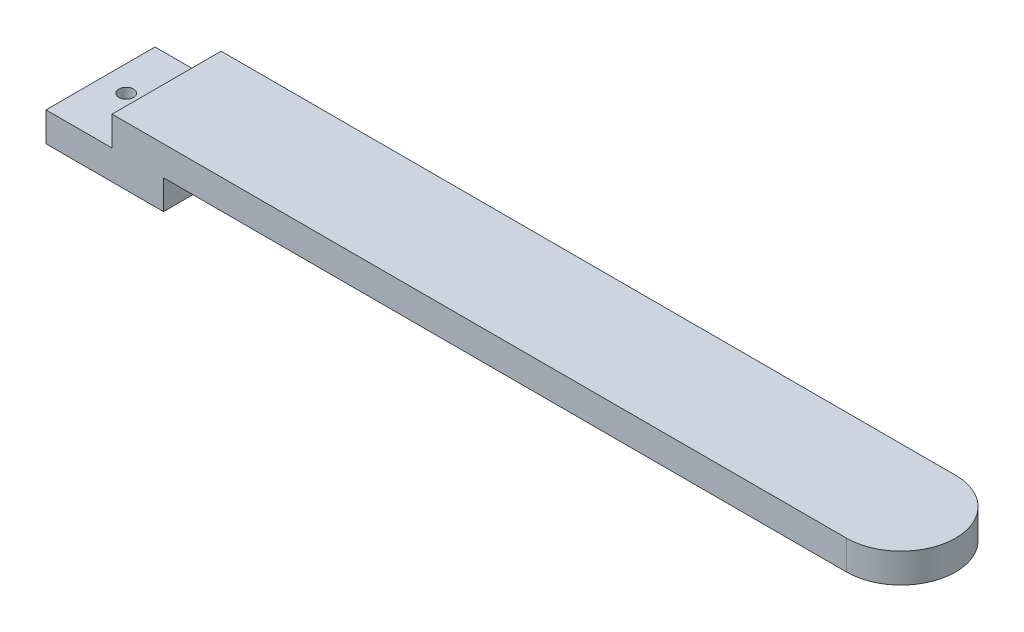
ISO-10303-21;
HEADER;
FILE_DESCRIPTION(('STEP AP214'),'2;1');
FILE_NAME('part.step','',(''),(''),'','','');
FILE_SCHEMA(('AUTOMOTIVE_DESIGN { 1 0 10303 214 1 1 1 1 }'));
ENDSEC;
DATA;
#1=APPLICATION_CONTEXT('core data for automotive mechanical design processes');
#2=APPLICATION_PROTOCOL_DEFINITION('international standard','automotive_design',2000,#1);
#3=PRODUCT_CONTEXT('',#1,'mechanical');
#4=PRODUCT('Part','Part','',(#3));
#5=PRODUCT_RELATED_PRODUCT_CATEGORY('part','',(#4));
#6=PRODUCT_DEFINITION_FORMATION('','',#4);
#7=PRODUCT_DEFINITION_CONTEXT('part definition',#1,'design');
#8=PRODUCT_DEFINITION('design','',#6,#7);
#9=PRODUCT_DEFINITION_SHAPE('','',#8);
#10=(LENGTH_UNIT() NAMED_UNIT(*) SI_UNIT(.MILLI.,.METRE.));
#11=(NAMED_UNIT(*) PLANE_ANGLE_UNIT() SI_UNIT($,.RADIAN.));
#12=(NAMED_UNIT(*) SI_UNIT($,.STERADIAN.) SOLID_ANGLE_UNIT());
#13=UNCERTAINTY_MEASURE_WITH_UNIT(LENGTH_MEASURE(1.E-05),#10,'distance_accuracy_value','');
#14=(GEOMETRIC_REPRESENTATION_CONTEXT(3) GLOBAL_UNCERTAINTY_ASSIGNED_CONTEXT((#13)) GLOBAL_UNIT_ASSIGNED_CONTEXT((#10,
#11,#12)) REPRESENTATION_CONTEXT('',''));
#15=CARTESIAN_POINT('',(0.,0.,0.));
#16=DIRECTION('',(0.,0.,1.));
#17=DIRECTION('',(1.,0.,0.));
#18=AXIS2_PLACEMENT_3D('',#15,#16,#17);
#19=CARTESIAN_POINT('',(200.,0.,0.));
#20=DIRECTION('',(0.,-1.,0.));
#21=DIRECTION('',(0.,0.,-1.));
#22=AXIS2_PLACEMENT_3D('',#19,#20,#21);
#23=PLANE('',#22);
#24=DIRECTION('',(1.,0.,0.));
#25=VECTOR('',#24,1.);
#26=CARTESIAN_POINT('',(0.,0.,14.84));
#27=LINE('',#26,#25);
#28=CARTESIAN_POINT('',(14.,0.,14.84));
#29=VERTEX_POINT('',#28);
#30=CARTESIAN_POINT('',(200.,0.,14.84));
#31=VERTEX_POINT('',#30);
#32=EDGE_CURVE('E165',#29,#31,#27,.T.);
#33=ORIENTED_EDGE('',*,*,#32,.F.);
#34=DIRECTION('',(0.,0.,-1.));
#35=VECTOR('',#34,1.);
#36=CARTESIAN_POINT('',(14.,0.,-14.84));
#37=LINE('',#36,#35);
#38=CARTESIAN_POINT('',(14.,0.,-14.84));
#39=VERTEX_POINT('',#38);
#40=EDGE_CURVE('E144',#29,#39,#37,.T.);
#41=ORIENTED_EDGE('',*,*,#40,.T.);
#42=DIRECTION('',(-1.,0.,0.));
#43=VECTOR('',#42,1.);
#44=CARTESIAN_POINT('',(0.,0.,-14.84));
#45=LINE('',#44,#43);
#46=CARTESIAN_POINT('',(200.,0.,-14.84));
#47=VERTEX_POINT('',#46);
#48=EDGE_CURVE('E118',#47,#39,#45,.T.);
#49=ORIENTED_EDGE('',*,*,#48,.F.);
#50=CARTESIAN_POINT('',(200.,0.,0.));
#51=DIRECTION('',(0.,1.,0.));
#52=DIRECTION('',(0.,0.,-1.));
#53=AXIS2_PLACEMENT_3D('',#50,#51,#52);
#54=CIRCLE('',#53,14.84);
#55=EDGE_CURVE('E77',#31,#47,#54,.T.);
#56=ORIENTED_EDGE('',*,*,#55,.F.);
#57=EDGE_LOOP('',(#33,#41,#49,#56));
#58=FACE_BOUND('',#57,.T.);
#59=ADVANCED_FACE('F37',(#58),#23,.T.);
#60=CARTESIAN_POINT('',(0.,8.,-14.84));
#61=DIRECTION('',(1.,0.,0.));
#62=DIRECTION('',(0.,0.,-1.));
#63=AXIS2_PLACEMENT_3D('',#60,#61,#62);
#64=PLANE('',#63);
#65=DIRECTION('',(0.,0.,1.));
#66=VECTOR('',#65,1.);
#67=CARTESIAN_POINT('',(0.,0.,-14.84));
#68=LINE('',#67,#66);
#69=CARTESIAN_POINT('',(0.,0.,-14.84));
#70=VERTEX_POINT('',#69);
#71=CARTESIAN_POINT('',(0.,0.,14.84));
#72=VERTEX_POINT('',#71);
#73=EDGE_CURVE('E152',#70,#72,#68,.T.);
#74=ORIENTED_EDGE('',*,*,#73,.T.);
#75=DIRECTION('',(0.,-1.,0.));
#76=VECTOR('',#75,1.);
#77=CARTESIAN_POINT('',(0.,8.,14.84));
#78=LINE('',#77,#76);
#79=CARTESIAN_POINT('',(0.,8.,14.84));
#80=VERTEX_POINT('',#79);
#81=EDGE_CURVE('E11',#80,#72,#78,.T.);
#82=ORIENTED_EDGE('',*,*,#81,.F.);
#83=DIRECTION('',(0.,0.,1.));
#84=VECTOR('',#83,1.);
#85=CARTESIAN_POINT('',(0.,8.,-14.84));
#86=LINE('',#85,#84);
#87=CARTESIAN_POINT('',(0.,8.,-14.84));
#88=VERTEX_POINT('',#87);
#89=EDGE_CURVE('E156',#88,#80,#86,.T.);
#90=ORIENTED_EDGE('',*,*,#89,.F.);
#91=DIRECTION('',(0.,-1.,0.));
#92=VECTOR('',#91,1.);
#93=CARTESIAN_POINT('',(0.,8.,-14.84));
#94=LINE('',#93,#92);
#95=EDGE_CURVE('E162',#88,#70,#94,.T.);
#96=ORIENTED_EDGE('',*,*,#95,.T.);
#97=EDGE_LOOP('',(#74,#82,#90,#96));
#98=FACE_BOUND('',#97,.T.);
#99=ADVANCED_FACE('F39',(#98),#64,.F.);
#100=CARTESIAN_POINT('',(0.,8.,14.84));
#101=DIRECTION('',(0.,0.,-1.));
#102=DIRECTION('',(-1.,0.,0.));
#103=AXIS2_PLACEMENT_3D('',#100,#101,#102);
#104=PLANE('',#103);
#105=ORIENTED_EDGE('',*,*,#81,.T.);
#106=DIRECTION('',(1.,0.,0.));
#107=VECTOR('',#106,1.);
#108=CARTESIAN_POINT('',(14.,0.,14.84));
#109=LINE('',#108,#107);
#110=CARTESIAN_POINT('',(-18.,0.,14.84));
#111=VERTEX_POINT('',#110);
#112=EDGE_CURVE('E134',#111,#72,#109,.T.);
#113=ORIENTED_EDGE('',*,*,#112,.F.);
#114=DIRECTION('',(0.,1.,0.));
#115=VECTOR('',#114,1.);
#116=CARTESIAN_POINT('',(-18.,-8.,14.84));
#117=LINE('',#116,#115);
#118=CARTESIAN_POINT('',(-18.,-8.,14.84));
#119=VERTEX_POINT('',#118);
#120=EDGE_CURVE('E153',#119,#111,#117,.T.);
#121=ORIENTED_EDGE('',*,*,#120,.F.);
#122=DIRECTION('',(1.,0.,0.));
#123=VECTOR('',#122,1.);
#124=CARTESIAN_POINT('',(14.,-8.,14.84));
#125=LINE('',#124,#123);
#126=CARTESIAN_POINT('',(14.,-8.,14.84));
#127=VERTEX_POINT('',#126);
#128=EDGE_CURVE('E120',#119,#127,#125,.T.);
#129=ORIENTED_EDGE('',*,*,#128,.T.);
#130=DIRECTION('',(0.,1.,0.));
#131=VECTOR('',#130,1.);
#132=CARTESIAN_POINT('',(14.,-8.,14.84));
#133=LINE('',#132,#131);
#134=EDGE_CURVE('E133',#127,#29,#133,.T.);
#135=ORIENTED_EDGE('',*,*,#134,.T.);
#136=ORIENTED_EDGE('',*,*,#32,.T.);
#137=DIRECTION('',(0.,-1.,0.));
#138=VECTOR('',#137,1.);
#139=CARTESIAN_POINT('',(200.,8.,14.84));
#140=LINE('',#139,#138);
#141=CARTESIAN_POINT('',(200.,8.,14.84));
#142=VERTEX_POINT('',#141);
#143=EDGE_CURVE('E45',#142,#31,#140,.T.);
#144=ORIENTED_EDGE('',*,*,#143,.F.);
#145=DIRECTION('',(1.,0.,0.));
#146=VECTOR('',#145,1.);
#147=CARTESIAN_POINT('',(0.,8.,14.84));
#148=LINE('',#147,#146);
#149=EDGE_CURVE('E84',#80,#142,#148,.T.);
#150=ORIENTED_EDGE('',*,*,#149,.F.);
#151=EDGE_LOOP('',(#105,#113,#121,#129,#135,#136,#144,#150));
#152=FACE_BOUND('',#151,.T.);
#153=ADVANCED_FACE('F176',(#152),#104,.F.);
#154=CARTESIAN_POINT('',(200.,8.,0.));
#155=DIRECTION('',(0.,-1.,0.));
#156=DIRECTION('',(0.,0.,-1.));
#157=AXIS2_PLACEMENT_3D('',#154,#155,#156);
#158=CYLINDRICAL_SURFACE('',#157,14.84);
#159=ORIENTED_EDGE('',*,*,#55,.T.);
#160=DIRECTION('',(0.,-1.,0.));
#161=VECTOR('',#160,1.);
#162=CARTESIAN_POINT('',(200.,8.,-14.84));
#163=LINE('',#162,#161);
#164=CARTESIAN_POINT('',(200.,8.,-14.84));
#165=VERTEX_POINT('',#164);
#166=EDGE_CURVE('E171',#165,#47,#163,.T.);
#167=ORIENTED_EDGE('',*,*,#166,.F.);
#168=CARTESIAN_POINT('',(200.,8.,0.));
#169=DIRECTION('',(0.,1.,0.));
#170=DIRECTION('',(0.,0.,-1.));
#171=AXIS2_PLACEMENT_3D('',#168,#169,#170);
#172=CIRCLE('',#171,14.84);
#173=EDGE_CURVE('E159',#142,#165,#172,.T.);
#174=ORIENTED_EDGE('',*,*,#173,.F.);
#175=ORIENTED_EDGE('',*,*,#143,.T.);
#176=EDGE_LOOP('',(#159,#167,#174,#175));
#177=FACE_BOUND('',#176,.T.);
#178=ADVANCED_FACE('F173',(#177),#158,.T.);
#179=CARTESIAN_POINT('',(0.,8.,-14.84));
#180=DIRECTION('',(0.,0.,1.));
#181=DIRECTION('',(1.,0.,0.));
#182=AXIS2_PLACEMENT_3D('',#179,#180,#181);
#183=PLANE('',#182);
#184=ORIENTED_EDGE('',*,*,#48,.T.);
#185=DIRECTION('',(0.,1.,0.));
#186=VECTOR('',#185,1.);
#187=CARTESIAN_POINT('',(14.,-8.,-14.84));
#188=LINE('',#187,#186);
#189=CARTESIAN_POINT('',(14.,-8.,-14.84));
#190=VERTEX_POINT('',#189);
#191=EDGE_CURVE('E52',#190,#39,#188,.T.);
#192=ORIENTED_EDGE('',*,*,#191,.F.);
#193=DIRECTION('',(-1.,0.,0.));
#194=VECTOR('',#193,1.);
#195=CARTESIAN_POINT('',(14.,-8.,-14.84));
#196=LINE('',#195,#194);
#197=CARTESIAN_POINT('',(-18.,-8.,-14.84));
#198=VERTEX_POINT('',#197);
#199=EDGE_CURVE('E116',#190,#198,#196,.T.);
#200=ORIENTED_EDGE('',*,*,#199,.T.);
#201=DIRECTION('',(0.,1.,0.));
#202=VECTOR('',#201,1.);
#203=CARTESIAN_POINT('',(-18.,-8.,-14.84));
#204=LINE('',#203,#202);
#205=CARTESIAN_POINT('',(-18.,0.,-14.84));
#206=VERTEX_POINT('',#205);
#207=EDGE_CURVE('E119',#198,#206,#204,.T.);
#208=ORIENTED_EDGE('',*,*,#207,.T.);
#209=DIRECTION('',(-1.,0.,0.));
#210=VECTOR('',#209,1.);
#211=CARTESIAN_POINT('',(14.,0.,-14.84));
#212=LINE('',#211,#210);
#213=EDGE_CURVE('E146',#70,#206,#212,.T.);
#214=ORIENTED_EDGE('',*,*,#213,.F.);
#215=ORIENTED_EDGE('',*,*,#95,.F.);
#216=DIRECTION('',(-1.,0.,0.));
#217=VECTOR('',#216,1.);
#218=CARTESIAN_POINT('',(0.,8.,-14.84));
#219=LINE('',#218,#217);
#220=EDGE_CURVE('E61',#165,#88,#219,.T.);
#221=ORIENTED_EDGE('',*,*,#220,.F.);
#222=ORIENTED_EDGE('',*,*,#166,.T.);
#223=EDGE_LOOP('',(#184,#192,#200,#208,#214,#215,#221,#222));
#224=FACE_BOUND('',#223,.T.);
#225=ADVANCED_FACE('F114',(#224),#183,.F.);
#226=CARTESIAN_POINT('',(200.,8.,0.));
#227=DIRECTION('',(0.,-1.,0.));
#228=DIRECTION('',(0.,0.,-1.));
#229=AXIS2_PLACEMENT_3D('',#226,#227,#228);
#230=PLANE('',#229);
#231=ORIENTED_EDGE('',*,*,#89,.T.);
#232=ORIENTED_EDGE('',*,*,#149,.T.);
#233=ORIENTED_EDGE('',*,*,#173,.T.);
#234=ORIENTED_EDGE('',*,*,#220,.T.);
#235=EDGE_LOOP('',(#231,#232,#233,#234));
#236=FACE_BOUND('',#235,.T.);
#237=ADVANCED_FACE('F186',(#236),#230,.F.);
#238=CARTESIAN_POINT('',(14.,-8.,-14.84));
#239=DIRECTION('',(1.,0.,0.));
#240=DIRECTION('',(0.,0.,-1.));
#241=AXIS2_PLACEMENT_3D('',#238,#239,#240);
#242=PLANE('',#241);
#243=ORIENTED_EDGE('',*,*,#40,.F.);
#244=ORIENTED_EDGE('',*,*,#134,.F.);
#245=DIRECTION('',(0.,0.,-1.));
#246=VECTOR('',#245,1.);
#247=CARTESIAN_POINT('',(14.,-8.,-14.84));
#248=LINE('',#247,#246);
#249=EDGE_CURVE('E127',#127,#190,#248,.T.);
#250=ORIENTED_EDGE('',*,*,#249,.T.);
#251=ORIENTED_EDGE('',*,*,#191,.T.);
#252=EDGE_LOOP('',(#243,#244,#250,#251));
#253=FACE_BOUND('',#252,.T.);
#254=ADVANCED_FACE('F132',(#253),#242,.T.);
#255=CARTESIAN_POINT('',(-18.,-8.,-14.84));
#256=DIRECTION('',(-1.,0.,0.));
#257=DIRECTION('',(0.,0.,1.));
#258=AXIS2_PLACEMENT_3D('',#255,#256,#257);
#259=PLANE('',#258);
#260=DIRECTION('',(0.,0.,1.));
#261=VECTOR('',#260,1.);
#262=CARTESIAN_POINT('',(-18.,0.,-14.84));
#263=LINE('',#262,#261);
#264=EDGE_CURVE('E136',#206,#111,#263,.T.);
#265=ORIENTED_EDGE('',*,*,#264,.F.);
#266=ORIENTED_EDGE('',*,*,#207,.F.);
#267=DIRECTION('',(0.,0.,1.));
#268=VECTOR('',#267,1.);
#269=CARTESIAN_POINT('',(-18.,-8.,-14.84));
#270=LINE('',#269,#268);
#271=EDGE_CURVE('E130',#198,#119,#270,.T.);
#272=ORIENTED_EDGE('',*,*,#271,.T.);
#273=ORIENTED_EDGE('',*,*,#120,.T.);
#274=EDGE_LOOP('',(#265,#266,#272,#273));
#275=FACE_BOUND('',#274,.T.);
#276=ADVANCED_FACE('F180',(#275),#259,.T.);
#277=CARTESIAN_POINT('',(0.,-8.,0.));
#278=DIRECTION('',(0.,-1.,0.));
#279=DIRECTION('',(0.,0.,-1.));
#280=AXIS2_PLACEMENT_3D('',#277,#278,#279);
#281=PLANE('',#280);
#282=CARTESIAN_POINT('',(-11.,-8.,0.));
#283=DIRECTION('',(0.,1.,0.));
#284=DIRECTION('',(0.,0.,1.));
#285=AXIS2_PLACEMENT_3D('',#282,#283,#284);
#286=CIRCLE('',#285,2.);
#287=CARTESIAN_POINT('',(-11.,-8.,2.));
#288=VERTEX_POINT('',#287);
#289=EDGE_CURVE('E147',#288,#288,#286,.T.);
#290=ORIENTED_EDGE('',*,*,#289,.T.);
#291=EDGE_LOOP('',(#290));
#292=FACE_BOUND('',#291,.T.);
#293=ORIENTED_EDGE('',*,*,#249,.F.);
#294=ORIENTED_EDGE('',*,*,#128,.F.);
#295=ORIENTED_EDGE('',*,*,#271,.F.);
#296=ORIENTED_EDGE('',*,*,#199,.F.);
#297=EDGE_LOOP('',(#293,#294,#295,#296));
#298=FACE_BOUND('',#297,.T.);
#299=ADVANCED_FACE('F125',(#292,#298),#281,.T.);
#300=CARTESIAN_POINT('',(0.,0.,0.));
#301=DIRECTION('',(0.,-1.,0.));
#302=DIRECTION('',(0.,0.,-1.));
#303=AXIS2_PLACEMENT_3D('',#300,#301,#302);
#304=PLANE('',#303);
#305=ORIENTED_EDGE('',*,*,#73,.F.);
#306=ORIENTED_EDGE('',*,*,#213,.T.);
#307=ORIENTED_EDGE('',*,*,#264,.T.);
#308=ORIENTED_EDGE('',*,*,#112,.T.);
#309=EDGE_LOOP('',(#305,#306,#307,#308));
#310=FACE_BOUND('',#309,.T.);
#311=CARTESIAN_POINT('',(-11.,0.,0.));
#312=DIRECTION('',(0.,1.,0.));
#313=DIRECTION('',(0.,0.,1.));
#314=AXIS2_PLACEMENT_3D('',#311,#312,#313);
#315=CIRCLE('',#314,2.);
#316=CARTESIAN_POINT('',(-11.,0.,2.));
#317=VERTEX_POINT('',#316);
#318=EDGE_CURVE('E139',#317,#317,#315,.T.);
#319=ORIENTED_EDGE('',*,*,#318,.F.);
#320=EDGE_LOOP('',(#319));
#321=FACE_BOUND('',#320,.T.);
#322=ADVANCED_FACE('F239',(#310,#321),#304,.F.);
#323=CARTESIAN_POINT('',(-11.,-8.,0.));
#324=DIRECTION('',(0.,1.,0.));
#325=DIRECTION('',(0.,0.,1.));
#326=AXIS2_PLACEMENT_3D('',#323,#324,#325);
#327=CYLINDRICAL_SURFACE('',#326,2.);
#328=ORIENTED_EDGE('',*,*,#289,.F.);
#329=EDGE_LOOP('',(#328));
#330=FACE_BOUND('',#329,.T.);
#331=ORIENTED_EDGE('',*,*,#318,.T.);
#332=EDGE_LOOP('',(#331));
#333=FACE_BOUND('',#332,.T.);
#334=ADVANCED_FACE('F249',(#330,#333),#327,.F.);
#335=CLOSED_SHELL('',(#59,#99,#153,#178,#225,#237,#254,#276,#299,#322,#334));
#336=MANIFOLD_SOLID_BREP('B2',#335);
#337=ADVANCED_BREP_SHAPE_REPRESENTATION('',(#18,#336),#14);
#338=SHAPE_DEFINITION_REPRESENTATION(#9,#337);
ENDSEC;
END-ISO-10303-21;
